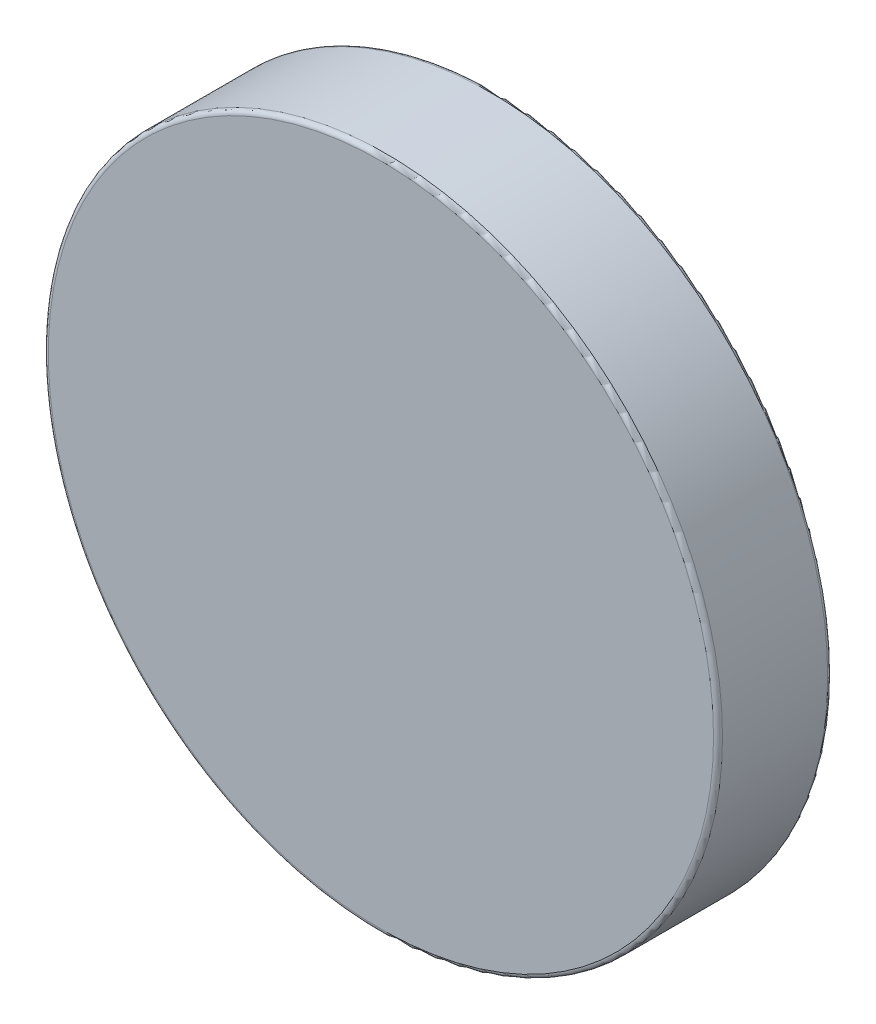
ISO-10303-21;
HEADER;
FILE_DESCRIPTION(('STEP AP214'),'2;1');
FILE_NAME('part.step','',(''),(''),'','','');
FILE_SCHEMA(('AUTOMOTIVE_DESIGN { 1 0 10303 214 1 1 1 1 }'));
ENDSEC;
DATA;
#1=APPLICATION_CONTEXT('core data for automotive mechanical design processes');
#2=APPLICATION_PROTOCOL_DEFINITION('international standard','automotive_design',2000,#1);
#3=PRODUCT_CONTEXT('',#1,'mechanical');
#4=PRODUCT('Part','Part','',(#3));
#5=PRODUCT_RELATED_PRODUCT_CATEGORY('part','',(#4));
#6=PRODUCT_DEFINITION_FORMATION('','',#4);
#7=PRODUCT_DEFINITION_CONTEXT('part definition',#1,'design');
#8=PRODUCT_DEFINITION('design','',#6,#7);
#9=PRODUCT_DEFINITION_SHAPE('','',#8);
#10=(LENGTH_UNIT() NAMED_UNIT(*) SI_UNIT(.MILLI.,.METRE.));
#11=(NAMED_UNIT(*) PLANE_ANGLE_UNIT() SI_UNIT($,.RADIAN.));
#12=(NAMED_UNIT(*) SI_UNIT($,.STERADIAN.) SOLID_ANGLE_UNIT());
#13=UNCERTAINTY_MEASURE_WITH_UNIT(LENGTH_MEASURE(1.E-05),#10,'distance_accuracy_value','');
#14=(GEOMETRIC_REPRESENTATION_CONTEXT(3) GLOBAL_UNCERTAINTY_ASSIGNED_CONTEXT((#13)) GLOBAL_UNIT_ASSIGNED_CONTEXT((#10,
#11,#12)) REPRESENTATION_CONTEXT('',''));
#15=CARTESIAN_POINT('',(0.,0.,0.));
#16=DIRECTION('',(0.,0.,1.));
#17=DIRECTION('',(1.,0.,0.));
#18=AXIS2_PLACEMENT_3D('',#15,#16,#17);
#19=CARTESIAN_POINT('',(0.,0.,1.));
#20=DIRECTION('',(0.,0.,1.));
#21=DIRECTION('',(1.,0.,0.));
#22=AXIS2_PLACEMENT_3D('',#19,#20,#21);
#23=TOROIDAL_SURFACE('',#22,74.,1.);
#24=CARTESIAN_POINT('',(0.,0.,0.));
#25=DIRECTION('',(0.,0.,1.));
#26=DIRECTION('',(1.,0.,0.));
#27=AXIS2_PLACEMENT_3D('',#24,#25,#26);
#28=CIRCLE('',#27,74.);
#29=CARTESIAN_POINT('',(74.,0.,0.));
#30=VERTEX_POINT('',#29);
#31=EDGE_CURVE('E44',#30,#30,#28,.F.);
#32=ORIENTED_EDGE('',*,*,#31,.F.);
#33=EDGE_LOOP('',(#32));
#34=FACE_BOUND('',#33,.T.);
#35=CARTESIAN_POINT('',(0.,0.,1.));
#36=DIRECTION('',(0.,0.,1.));
#37=DIRECTION('',(1.,0.,0.));
#38=AXIS2_PLACEMENT_3D('',#35,#36,#37);
#39=CIRCLE('',#38,75.);
#40=CARTESIAN_POINT('',(75.,0.,1.));
#41=VERTEX_POINT('',#40);
#42=EDGE_CURVE('E10',#41,#41,#39,.T.);
#43=ORIENTED_EDGE('',*,*,#42,.F.);
#44=EDGE_LOOP('',(#43));
#45=FACE_BOUND('',#44,.T.);
#46=ADVANCED_FACE('F37',(#34,#45),#23,.T.);
#47=CARTESIAN_POINT('',(0.,0.,24.4));
#48=DIRECTION('',(0.,0.,1.));
#49=DIRECTION('',(1.,0.,0.));
#50=AXIS2_PLACEMENT_3D('',#47,#48,#49);
#51=TOROIDAL_SURFACE('',#50,74.,1.);
#52=CARTESIAN_POINT('',(0.,0.,25.4));
#53=DIRECTION('',(0.,0.,1.));
#54=DIRECTION('',(1.,0.,0.));
#55=AXIS2_PLACEMENT_3D('',#52,#53,#54);
#56=CIRCLE('',#55,74.);
#57=CARTESIAN_POINT('',(74.,0.,25.4));
#58=VERTEX_POINT('',#57);
#59=EDGE_CURVE('E54',#58,#58,#56,.T.);
#60=ORIENTED_EDGE('',*,*,#59,.F.);
#61=EDGE_LOOP('',(#60));
#62=FACE_BOUND('',#61,.T.);
#63=CARTESIAN_POINT('',(0.,0.,24.4));
#64=DIRECTION('',(0.,0.,1.));
#65=DIRECTION('',(1.,0.,0.));
#66=AXIS2_PLACEMENT_3D('',#63,#64,#65);
#67=CIRCLE('',#66,75.);
#68=CARTESIAN_POINT('',(75.,0.,24.4));
#69=VERTEX_POINT('',#68);
#70=EDGE_CURVE('E49',#69,#69,#67,.F.);
#71=ORIENTED_EDGE('',*,*,#70,.F.);
#72=EDGE_LOOP('',(#71));
#73=FACE_BOUND('',#72,.T.);
#74=ADVANCED_FACE('F63',(#62,#73),#51,.T.);
#75=CARTESIAN_POINT('',(0.,0.,25.4));
#76=DIRECTION('',(0.,0.,-1.));
#77=DIRECTION('',(-1.,0.,0.));
#78=AXIS2_PLACEMENT_3D('',#75,#76,#77);
#79=CYLINDRICAL_SURFACE('',#78,75.);
#80=ORIENTED_EDGE('',*,*,#42,.T.);
#81=EDGE_LOOP('',(#80));
#82=FACE_BOUND('',#81,.T.);
#83=ORIENTED_EDGE('',*,*,#70,.T.);
#84=EDGE_LOOP('',(#83));
#85=FACE_BOUND('',#84,.T.);
#86=ADVANCED_FACE('F66',(#82,#85),#79,.T.);
#87=CARTESIAN_POINT('',(0.,0.,25.4));
#88=DIRECTION('',(0.,0.,1.));
#89=DIRECTION('',(1.,0.,0.));
#90=AXIS2_PLACEMENT_3D('',#87,#88,#89);
#91=PLANE('',#90);
#92=ORIENTED_EDGE('',*,*,#59,.T.);
#93=EDGE_LOOP('',(#92));
#94=FACE_BOUND('',#93,.T.);
#95=ADVANCED_FACE('F61',(#94),#91,.T.);
#96=CARTESIAN_POINT('',(0.,0.,0.));
#97=DIRECTION('',(0.,0.,1.));
#98=DIRECTION('',(1.,0.,0.));
#99=AXIS2_PLACEMENT_3D('',#96,#97,#98);
#100=PLANE('',#99);
#101=ORIENTED_EDGE('',*,*,#31,.T.);
#102=EDGE_LOOP('',(#101));
#103=FACE_BOUND('',#102,.T.);
#104=ADVANCED_FACE('F74',(#103),#100,.F.);
#105=CLOSED_SHELL('',(#46,#74,#86,#95,#104));
#106=MANIFOLD_SOLID_BREP('B2',#105);
#107=ADVANCED_BREP_SHAPE_REPRESENTATION('',(#18,#106),#14);
#108=SHAPE_DEFINITION_REPRESENTATION(#9,#107);
ENDSEC;
END-ISO-10303-21;
